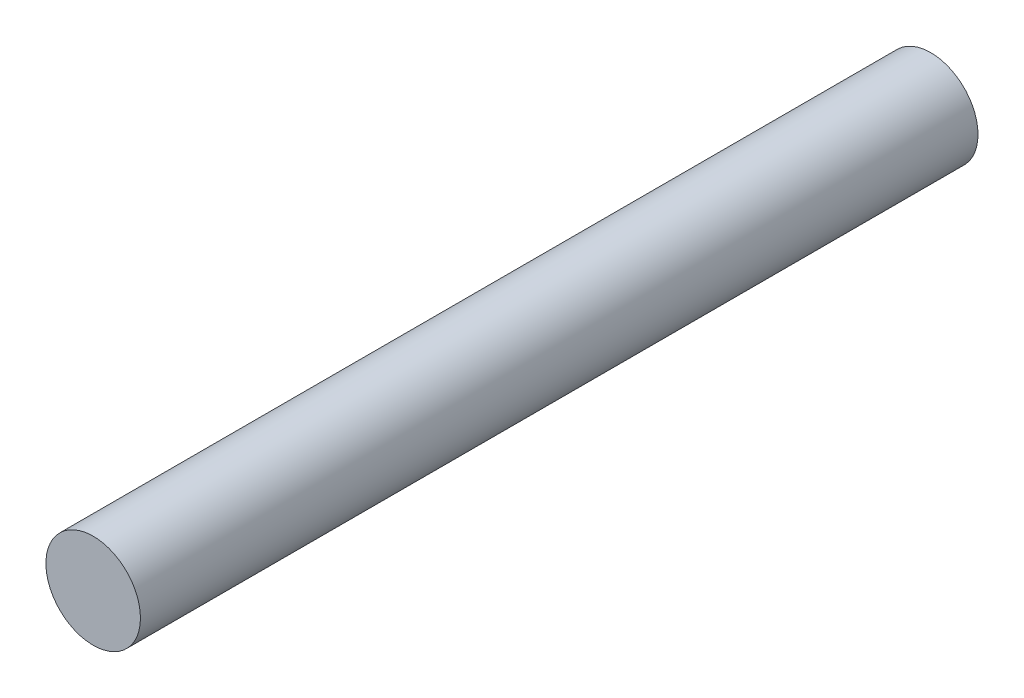
ISO-10303-21;
HEADER;
FILE_DESCRIPTION(('STEP AP214'),'2;1');
FILE_NAME('part.step','',(''),(''),'','','');
FILE_SCHEMA(('AUTOMOTIVE_DESIGN { 1 0 10303 214 1 1 1 1 }'));
ENDSEC;
DATA;
#1=APPLICATION_CONTEXT('core data for automotive mechanical design processes');
#2=APPLICATION_PROTOCOL_DEFINITION('international standard','automotive_design',2000,#1);
#3=PRODUCT_CONTEXT('',#1,'mechanical');
#4=PRODUCT('Part','Part','',(#3));
#5=PRODUCT_RELATED_PRODUCT_CATEGORY('part','',(#4));
#6=PRODUCT_DEFINITION_FORMATION('','',#4);
#7=PRODUCT_DEFINITION_CONTEXT('part definition',#1,'design');
#8=PRODUCT_DEFINITION('design','',#6,#7);
#9=PRODUCT_DEFINITION_SHAPE('','',#8);
#10=(LENGTH_UNIT() NAMED_UNIT(*) SI_UNIT(.MILLI.,.METRE.));
#11=(NAMED_UNIT(*) PLANE_ANGLE_UNIT() SI_UNIT($,.RADIAN.));
#12=(NAMED_UNIT(*) SI_UNIT($,.STERADIAN.) SOLID_ANGLE_UNIT());
#13=UNCERTAINTY_MEASURE_WITH_UNIT(LENGTH_MEASURE(1.E-05),#10,'distance_accuracy_value','');
#14=(GEOMETRIC_REPRESENTATION_CONTEXT(3) GLOBAL_UNCERTAINTY_ASSIGNED_CONTEXT((#13)) GLOBAL_UNIT_ASSIGNED_CONTEXT((#10,
#11,#12)) REPRESENTATION_CONTEXT('',''));
#15=CARTESIAN_POINT('',(0.,0.,0.));
#16=DIRECTION('',(0.,0.,1.));
#17=DIRECTION('',(1.,0.,0.));
#18=AXIS2_PLACEMENT_3D('',#15,#16,#17);
#19=CARTESIAN_POINT('',(0.,0.,-44.3));
#20=DIRECTION('',(0.,0.,1.));
#21=DIRECTION('',(-1.,0.,0.));
#22=AXIS2_PLACEMENT_3D('',#19,#20,#21);
#23=CYLINDRICAL_SURFACE('',#22,2.5);
#24=CARTESIAN_POINT('',(0.,0.,-44.3));
#25=DIRECTION('',(0.,0.,1.));
#26=DIRECTION('',(1.,0.,0.));
#27=AXIS2_PLACEMENT_3D('',#24,#25,#26);
#28=CIRCLE('',#27,2.5);
#29=CARTESIAN_POINT('',(2.5,0.,-44.3));
#30=VERTEX_POINT('',#29);
#31=EDGE_CURVE('E10',#30,#30,#28,.T.);
#32=ORIENTED_EDGE('',*,*,#31,.T.);
#33=EDGE_LOOP('',(#32));
#34=FACE_BOUND('',#33,.T.);
#35=CARTESIAN_POINT('',(0.,0.,0.));
#36=DIRECTION('',(0.,0.,1.));
#37=DIRECTION('',(1.,0.,0.));
#38=AXIS2_PLACEMENT_3D('',#35,#36,#37);
#39=CIRCLE('',#38,2.5);
#40=CARTESIAN_POINT('',(2.5,0.,0.));
#41=VERTEX_POINT('',#40);
#42=EDGE_CURVE('E40',#41,#41,#39,.T.);
#43=ORIENTED_EDGE('',*,*,#42,.F.);
#44=EDGE_LOOP('',(#43));
#45=FACE_BOUND('',#44,.T.);
#46=ADVANCED_FACE('F37',(#34,#45),#23,.T.);
#47=CARTESIAN_POINT('',(0.,0.,-44.3));
#48=DIRECTION('',(0.,0.,-1.));
#49=DIRECTION('',(1.,0.,0.));
#50=AXIS2_PLACEMENT_3D('',#47,#48,#49);
#51=PLANE('',#50);
#52=ORIENTED_EDGE('',*,*,#31,.F.);
#53=EDGE_LOOP('',(#52));
#54=FACE_BOUND('',#53,.T.);
#55=ADVANCED_FACE('F52',(#54),#51,.T.);
#56=CARTESIAN_POINT('',(0.,0.,0.));
#57=DIRECTION('',(0.,0.,-1.));
#58=DIRECTION('',(1.,0.,0.));
#59=AXIS2_PLACEMENT_3D('',#56,#57,#58);
#60=PLANE('',#59);
#61=ORIENTED_EDGE('',*,*,#42,.T.);
#62=EDGE_LOOP('',(#61));
#63=FACE_BOUND('',#62,.T.);
#64=ADVANCED_FACE('F49',(#63),#60,.F.);
#65=CLOSED_SHELL('',(#46,#55,#64));
#66=MANIFOLD_SOLID_BREP('B2',#65);
#67=ADVANCED_BREP_SHAPE_REPRESENTATION('',(#18,#66),#14);
#68=SHAPE_DEFINITION_REPRESENTATION(#9,#67);
ENDSEC;
END-ISO-10303-21;
